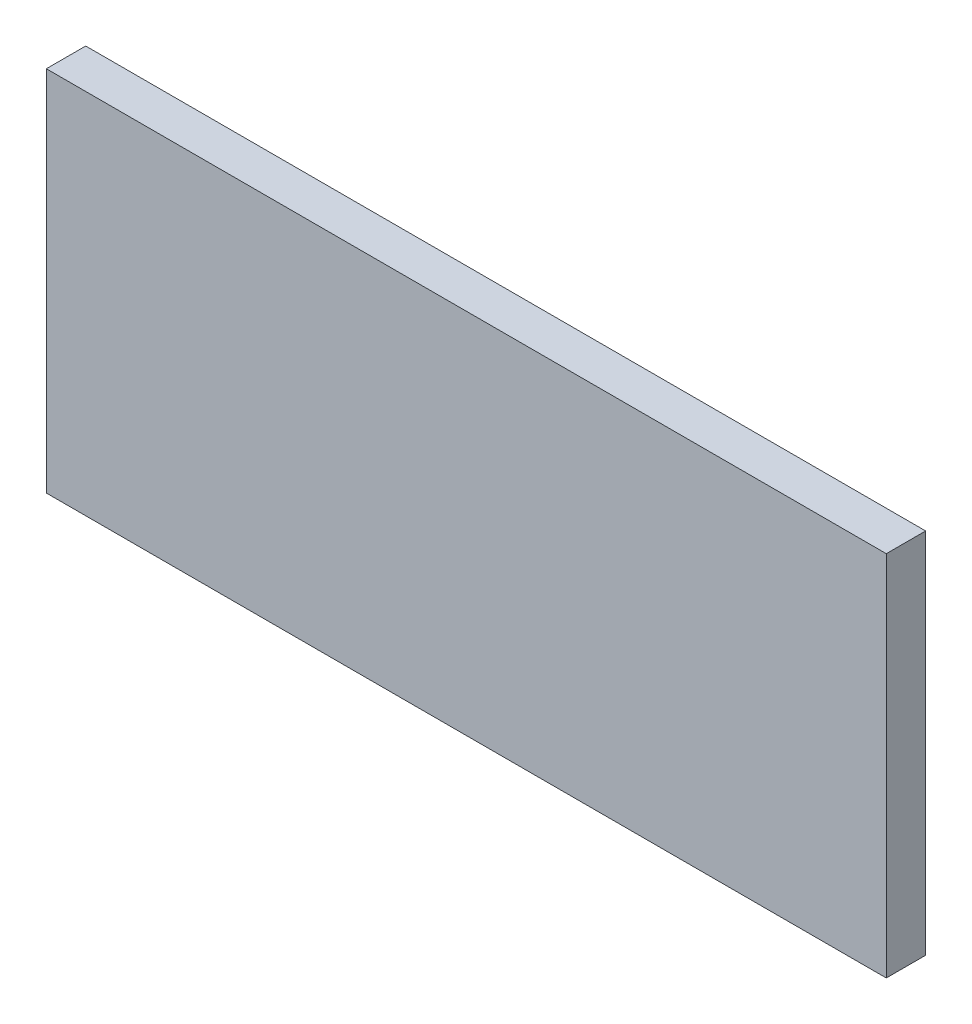
ISO-10303-21;
HEADER;
FILE_DESCRIPTION(('STEP AP214'),'2;1');
FILE_NAME('part.step','',(''),(''),'','','');
FILE_SCHEMA(('AUTOMOTIVE_DESIGN { 1 0 10303 214 1 1 1 1 }'));
ENDSEC;
DATA;
#1=APPLICATION_CONTEXT('core data for automotive mechanical design processes');
#2=APPLICATION_PROTOCOL_DEFINITION('international standard','automotive_design',2000,#1);
#3=PRODUCT_CONTEXT('',#1,'mechanical');
#4=PRODUCT('Part','Part','',(#3));
#5=PRODUCT_RELATED_PRODUCT_CATEGORY('part','',(#4));
#6=PRODUCT_DEFINITION_FORMATION('','',#4);
#7=PRODUCT_DEFINITION_CONTEXT('part definition',#1,'design');
#8=PRODUCT_DEFINITION('design','',#6,#7);
#9=PRODUCT_DEFINITION_SHAPE('','',#8);
#10=(LENGTH_UNIT() NAMED_UNIT(*) SI_UNIT(.MILLI.,.METRE.));
#11=(NAMED_UNIT(*) PLANE_ANGLE_UNIT() SI_UNIT($,.RADIAN.));
#12=(NAMED_UNIT(*) SI_UNIT($,.STERADIAN.) SOLID_ANGLE_UNIT());
#13=UNCERTAINTY_MEASURE_WITH_UNIT(LENGTH_MEASURE(1.E-05),#10,'distance_accuracy_value','');
#14=(GEOMETRIC_REPRESENTATION_CONTEXT(3) GLOBAL_UNCERTAINTY_ASSIGNED_CONTEXT((#13)) GLOBAL_UNIT_ASSIGNED_CONTEXT((#10,
#11,#12)) REPRESENTATION_CONTEXT('',''));
#15=CARTESIAN_POINT('',(0.,0.,0.));
#16=DIRECTION('',(0.,0.,1.));
#17=DIRECTION('',(1.,0.,0.));
#18=AXIS2_PLACEMENT_3D('',#15,#16,#17);
#19=CARTESIAN_POINT('',(160.,70.,15.));
#20=DIRECTION('',(-1.,0.,0.));
#21=DIRECTION('',(0.,-1.,0.));
#22=AXIS2_PLACEMENT_3D('',#19,#20,#21);
#23=PLANE('',#22);
#24=DIRECTION('',(0.,1.,0.));
#25=VECTOR('',#24,1.);
#26=CARTESIAN_POINT('',(160.,70.,0.));
#27=LINE('',#26,#25);
#28=CARTESIAN_POINT('',(160.,-70.,0.));
#29=VERTEX_POINT('',#28);
#30=CARTESIAN_POINT('',(160.,70.,0.));
#31=VERTEX_POINT('',#30);
#32=EDGE_CURVE('E107',#29,#31,#27,.T.);
#33=ORIENTED_EDGE('',*,*,#32,.T.);
#34=DIRECTION('',(0.,0.,-1.));
#35=VECTOR('',#34,1.);
#36=CARTESIAN_POINT('',(160.,70.,15.));
#37=LINE('',#36,#35);
#38=CARTESIAN_POINT('',(160.,70.,15.));
#39=VERTEX_POINT('',#38);
#40=EDGE_CURVE('E11',#39,#31,#37,.T.);
#41=ORIENTED_EDGE('',*,*,#40,.F.);
#42=DIRECTION('',(0.,1.,0.));
#43=VECTOR('',#42,1.);
#44=CARTESIAN_POINT('',(160.,70.,15.));
#45=LINE('',#44,#43);
#46=CARTESIAN_POINT('',(160.,-70.,15.));
#47=VERTEX_POINT('',#46);
#48=EDGE_CURVE('E91',#47,#39,#45,.T.);
#49=ORIENTED_EDGE('',*,*,#48,.F.);
#50=DIRECTION('',(0.,0.,-1.));
#51=VECTOR('',#50,1.);
#52=CARTESIAN_POINT('',(160.,-70.,15.));
#53=LINE('',#52,#51);
#54=EDGE_CURVE('E103',#47,#29,#53,.T.);
#55=ORIENTED_EDGE('',*,*,#54,.T.);
#56=EDGE_LOOP('',(#33,#41,#49,#55));
#57=FACE_BOUND('',#56,.T.);
#58=ADVANCED_FACE('F39',(#57),#23,.F.);
#59=CARTESIAN_POINT('',(-160.,70.,15.));
#60=DIRECTION('',(0.,-1.,0.));
#61=DIRECTION('',(0.,0.,-1.));
#62=AXIS2_PLACEMENT_3D('',#59,#60,#61);
#63=PLANE('',#62);
#64=DIRECTION('',(-1.,0.,0.));
#65=VECTOR('',#64,1.);
#66=CARTESIAN_POINT('',(-160.,70.,0.));
#67=LINE('',#66,#65);
#68=CARTESIAN_POINT('',(-160.,70.,0.));
#69=VERTEX_POINT('',#68);
#70=EDGE_CURVE('E96',#31,#69,#67,.T.);
#71=ORIENTED_EDGE('',*,*,#70,.T.);
#72=DIRECTION('',(0.,0.,-1.));
#73=VECTOR('',#72,1.);
#74=CARTESIAN_POINT('',(-160.,70.,15.));
#75=LINE('',#74,#73);
#76=CARTESIAN_POINT('',(-160.,70.,15.));
#77=VERTEX_POINT('',#76);
#78=EDGE_CURVE('E48',#77,#69,#75,.T.);
#79=ORIENTED_EDGE('',*,*,#78,.F.);
#80=DIRECTION('',(-1.,0.,0.));
#81=VECTOR('',#80,1.);
#82=CARTESIAN_POINT('',(-160.,70.,15.));
#83=LINE('',#82,#81);
#84=EDGE_CURVE('E86',#39,#77,#83,.T.);
#85=ORIENTED_EDGE('',*,*,#84,.F.);
#86=ORIENTED_EDGE('',*,*,#40,.T.);
#87=EDGE_LOOP('',(#71,#79,#85,#86));
#88=FACE_BOUND('',#87,.T.);
#89=ADVANCED_FACE('F95',(#88),#63,.F.);
#90=CARTESIAN_POINT('',(-160.,70.,15.));
#91=DIRECTION('',(1.,0.,0.));
#92=DIRECTION('',(0.,1.,0.));
#93=AXIS2_PLACEMENT_3D('',#90,#91,#92);
#94=PLANE('',#93);
#95=DIRECTION('',(0.,-1.,0.));
#96=VECTOR('',#95,1.);
#97=CARTESIAN_POINT('',(-160.,70.,0.));
#98=LINE('',#97,#96);
#99=CARTESIAN_POINT('',(-160.,-70.,0.));
#100=VERTEX_POINT('',#99);
#101=EDGE_CURVE('E73',#69,#100,#98,.T.);
#102=ORIENTED_EDGE('',*,*,#101,.T.);
#103=DIRECTION('',(0.,0.,-1.));
#104=VECTOR('',#103,1.);
#105=CARTESIAN_POINT('',(-160.,-70.,15.));
#106=LINE('',#105,#104);
#107=CARTESIAN_POINT('',(-160.,-70.,15.));
#108=VERTEX_POINT('',#107);
#109=EDGE_CURVE('E98',#108,#100,#106,.T.);
#110=ORIENTED_EDGE('',*,*,#109,.F.);
#111=DIRECTION('',(0.,-1.,0.));
#112=VECTOR('',#111,1.);
#113=CARTESIAN_POINT('',(-160.,70.,15.));
#114=LINE('',#113,#112);
#115=EDGE_CURVE('E89',#77,#108,#114,.T.);
#116=ORIENTED_EDGE('',*,*,#115,.F.);
#117=ORIENTED_EDGE('',*,*,#78,.T.);
#118=EDGE_LOOP('',(#102,#110,#116,#117));
#119=FACE_BOUND('',#118,.T.);
#120=ADVANCED_FACE('F99',(#119),#94,.F.);
#121=CARTESIAN_POINT('',(-160.,-70.,15.));
#122=DIRECTION('',(0.,1.,0.));
#123=DIRECTION('',(0.,0.,1.));
#124=AXIS2_PLACEMENT_3D('',#121,#122,#123);
#125=PLANE('',#124);
#126=DIRECTION('',(1.,0.,0.));
#127=VECTOR('',#126,1.);
#128=CARTESIAN_POINT('',(-160.,-70.,0.));
#129=LINE('',#128,#127);
#130=EDGE_CURVE('E79',#100,#29,#129,.T.);
#131=ORIENTED_EDGE('',*,*,#130,.T.);
#132=ORIENTED_EDGE('',*,*,#54,.F.);
#133=DIRECTION('',(1.,0.,0.));
#134=VECTOR('',#133,1.);
#135=CARTESIAN_POINT('',(-160.,-70.,15.));
#136=LINE('',#135,#134);
#137=EDGE_CURVE('E56',#108,#47,#136,.T.);
#138=ORIENTED_EDGE('',*,*,#137,.F.);
#139=ORIENTED_EDGE('',*,*,#109,.T.);
#140=EDGE_LOOP('',(#131,#132,#138,#139));
#141=FACE_BOUND('',#140,.T.);
#142=ADVANCED_FACE('F120',(#141),#125,.F.);
#143=CARTESIAN_POINT('',(0.,0.,15.));
#144=DIRECTION('',(0.,0.,1.));
#145=DIRECTION('',(1.,0.,0.));
#146=AXIS2_PLACEMENT_3D('',#143,#144,#145);
#147=PLANE('',#146);
#148=ORIENTED_EDGE('',*,*,#48,.T.);
#149=ORIENTED_EDGE('',*,*,#84,.T.);
#150=ORIENTED_EDGE('',*,*,#115,.T.);
#151=ORIENTED_EDGE('',*,*,#137,.T.);
#152=EDGE_LOOP('',(#148,#149,#150,#151));
#153=FACE_BOUND('',#152,.T.);
#154=ADVANCED_FACE('F87',(#153),#147,.T.);
#155=CARTESIAN_POINT('',(0.,0.,0.));
#156=DIRECTION('',(0.,0.,1.));
#157=DIRECTION('',(1.,0.,0.));
#158=AXIS2_PLACEMENT_3D('',#155,#156,#157);
#159=PLANE('',#158);
#160=ORIENTED_EDGE('',*,*,#32,.F.);
#161=ORIENTED_EDGE('',*,*,#130,.F.);
#162=ORIENTED_EDGE('',*,*,#101,.F.);
#163=ORIENTED_EDGE('',*,*,#70,.F.);
#164=EDGE_LOOP('',(#160,#161,#162,#163));
#165=FACE_BOUND('',#164,.T.);
#166=ADVANCED_FACE('F123',(#165),#159,.F.);
#167=CLOSED_SHELL('',(#58,#89,#120,#142,#154,#166));
#168=MANIFOLD_SOLID_BREP('B2',#167);
#169=ADVANCED_BREP_SHAPE_REPRESENTATION('',(#18,#168),#14);
#170=SHAPE_DEFINITION_REPRESENTATION(#9,#169);
ENDSEC;
END-ISO-10303-21;
